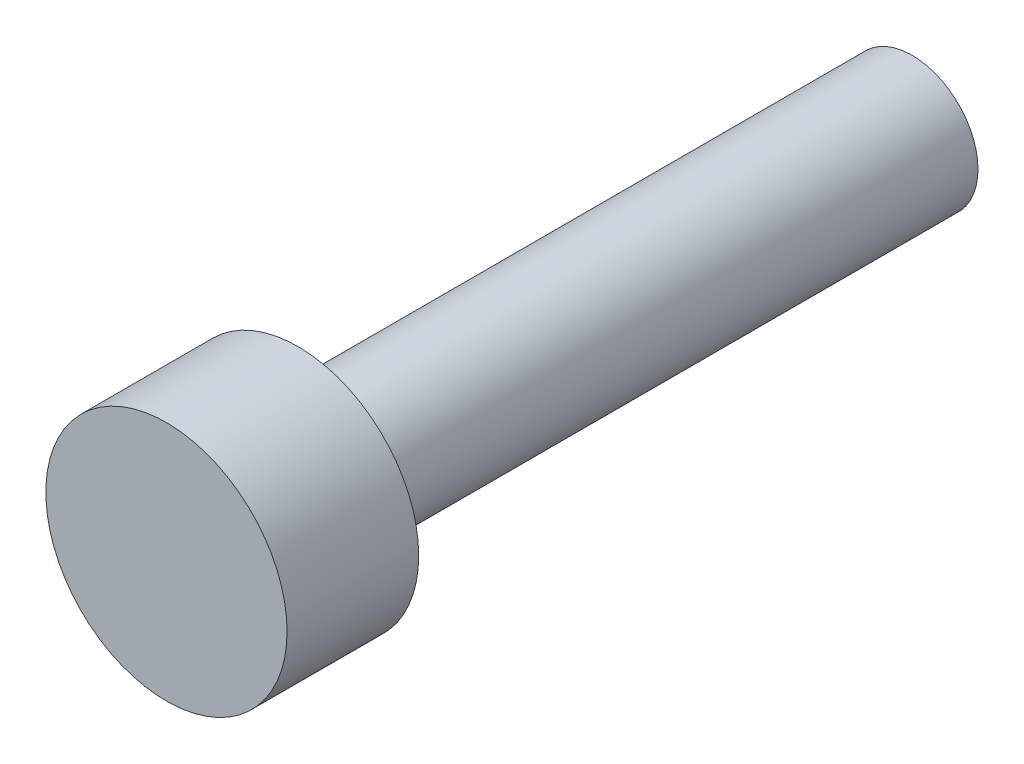
ISO-10303-21;
HEADER;
FILE_DESCRIPTION(('STEP AP214'),'2;1');
FILE_NAME('part.step','',(''),(''),'','','');
FILE_SCHEMA(('AUTOMOTIVE_DESIGN { 1 0 10303 214 1 1 1 1 }'));
ENDSEC;
DATA;
#1=APPLICATION_CONTEXT('core data for automotive mechanical design processes');
#2=APPLICATION_PROTOCOL_DEFINITION('international standard','automotive_design',2000,#1);
#3=PRODUCT_CONTEXT('',#1,'mechanical');
#4=PRODUCT('Part','Part','',(#3));
#5=PRODUCT_RELATED_PRODUCT_CATEGORY('part','',(#4));
#6=PRODUCT_DEFINITION_FORMATION('','',#4);
#7=PRODUCT_DEFINITION_CONTEXT('part definition',#1,'design');
#8=PRODUCT_DEFINITION('design','',#6,#7);
#9=PRODUCT_DEFINITION_SHAPE('','',#8);
#10=(LENGTH_UNIT() NAMED_UNIT(*) SI_UNIT(.MILLI.,.METRE.));
#11=(NAMED_UNIT(*) PLANE_ANGLE_UNIT() SI_UNIT($,.RADIAN.));
#12=(NAMED_UNIT(*) SI_UNIT($,.STERADIAN.) SOLID_ANGLE_UNIT());
#13=UNCERTAINTY_MEASURE_WITH_UNIT(LENGTH_MEASURE(1.E-05),#10,'distance_accuracy_value','');
#14=(GEOMETRIC_REPRESENTATION_CONTEXT(3) GLOBAL_UNCERTAINTY_ASSIGNED_CONTEXT((#13)) GLOBAL_UNIT_ASSIGNED_CONTEXT((#10,
#11,#12)) REPRESENTATION_CONTEXT('',''));
#15=CARTESIAN_POINT('',(0.,0.,0.));
#16=DIRECTION('',(0.,0.,1.));
#17=DIRECTION('',(1.,0.,0.));
#18=AXIS2_PLACEMENT_3D('',#15,#16,#17);
#19=CARTESIAN_POINT('',(0.,0.,0.));
#20=DIRECTION('',(0.,0.,-1.));
#21=DIRECTION('',(-1.,0.,0.));
#22=AXIS2_PLACEMENT_3D('',#19,#20,#21);
#23=CYLINDRICAL_SURFACE('',#22,1.5);
#24=CARTESIAN_POINT('',(0.,0.,0.));
#25=DIRECTION('',(0.,0.,1.));
#26=DIRECTION('',(1.,0.,0.));
#27=AXIS2_PLACEMENT_3D('',#24,#25,#26);
#28=CIRCLE('',#27,1.5);
#29=CARTESIAN_POINT('',(1.5,0.,0.));
#30=VERTEX_POINT('',#29);
#31=EDGE_CURVE('E10',#30,#30,#28,.T.);
#32=ORIENTED_EDGE('',*,*,#31,.F.);
#33=EDGE_LOOP('',(#32));
#34=FACE_BOUND('',#33,.T.);
#35=CARTESIAN_POINT('',(0.,0.,-14.));
#36=DIRECTION('',(0.,0.,1.));
#37=DIRECTION('',(1.,0.,0.));
#38=AXIS2_PLACEMENT_3D('',#35,#36,#37);
#39=CIRCLE('',#38,1.5);
#40=CARTESIAN_POINT('',(1.5,0.,-14.));
#41=VERTEX_POINT('',#40);
#42=EDGE_CURVE('E37',#41,#41,#39,.T.);
#43=ORIENTED_EDGE('',*,*,#42,.T.);
#44=EDGE_LOOP('',(#43));
#45=FACE_BOUND('',#44,.T.);
#46=ADVANCED_FACE('F40',(#34,#45),#23,.T.);
#47=CARTESIAN_POINT('',(0.,0.,-14.));
#48=DIRECTION('',(0.,0.,1.));
#49=DIRECTION('',(1.,0.,0.));
#50=AXIS2_PLACEMENT_3D('',#47,#48,#49);
#51=PLANE('',#50);
#52=ORIENTED_EDGE('',*,*,#42,.F.);
#53=EDGE_LOOP('',(#52));
#54=FACE_BOUND('',#53,.T.);
#55=ADVANCED_FACE('F58',(#54),#51,.F.);
#56=CARTESIAN_POINT('',(0.,0.,3.));
#57=DIRECTION('',(0.,0.,-1.));
#58=DIRECTION('',(-1.,0.,0.));
#59=AXIS2_PLACEMENT_3D('',#56,#57,#58);
#60=CYLINDRICAL_SURFACE('',#59,2.75);
#61=CARTESIAN_POINT('',(0.,0.,3.));
#62=DIRECTION('',(0.,0.,1.));
#63=DIRECTION('',(1.,0.,0.));
#64=AXIS2_PLACEMENT_3D('',#61,#62,#63);
#65=CIRCLE('',#64,2.75);
#66=CARTESIAN_POINT('',(2.75,0.,3.));
#67=VERTEX_POINT('',#66);
#68=EDGE_CURVE('E50',#67,#67,#65,.T.);
#69=ORIENTED_EDGE('',*,*,#68,.F.);
#70=EDGE_LOOP('',(#69));
#71=FACE_BOUND('',#70,.T.);
#72=CARTESIAN_POINT('',(0.,0.,0.));
#73=DIRECTION('',(0.,0.,1.));
#74=DIRECTION('',(1.,0.,0.));
#75=AXIS2_PLACEMENT_3D('',#72,#73,#74);
#76=CIRCLE('',#75,2.75);
#77=CARTESIAN_POINT('',(2.75,0.,0.));
#78=VERTEX_POINT('',#77);
#79=EDGE_CURVE('E47',#78,#78,#76,.T.);
#80=ORIENTED_EDGE('',*,*,#79,.T.);
#81=EDGE_LOOP('',(#80));
#82=FACE_BOUND('',#81,.T.);
#83=ADVANCED_FACE('F60',(#71,#82),#60,.T.);
#84=CARTESIAN_POINT('',(0.,0.,3.));
#85=DIRECTION('',(0.,0.,1.));
#86=DIRECTION('',(1.,0.,0.));
#87=AXIS2_PLACEMENT_3D('',#84,#85,#86);
#88=PLANE('',#87);
#89=ORIENTED_EDGE('',*,*,#68,.T.);
#90=EDGE_LOOP('',(#89));
#91=FACE_BOUND('',#90,.T.);
#92=ADVANCED_FACE('F54',(#91),#88,.T.);
#93=CARTESIAN_POINT('',(0.,0.,0.));
#94=DIRECTION('',(0.,0.,1.));
#95=DIRECTION('',(1.,0.,0.));
#96=AXIS2_PLACEMENT_3D('',#93,#94,#95);
#97=PLANE('',#96);
#98=ORIENTED_EDGE('',*,*,#31,.T.);
#99=EDGE_LOOP('',(#98));
#100=FACE_BOUND('',#99,.T.);
#101=ORIENTED_EDGE('',*,*,#79,.F.);
#102=EDGE_LOOP('',(#101));
#103=FACE_BOUND('',#102,.T.);
#104=ADVANCED_FACE('F65',(#100,#103),#97,.F.);
#105=CLOSED_SHELL('',(#46,#55,#83,#92,#104));
#106=MANIFOLD_SOLID_BREP('B2',#105);
#107=ADVANCED_BREP_SHAPE_REPRESENTATION('',(#18,#106),#14);
#108=SHAPE_DEFINITION_REPRESENTATION(#9,#107);
ENDSEC;
END-ISO-10303-21;
